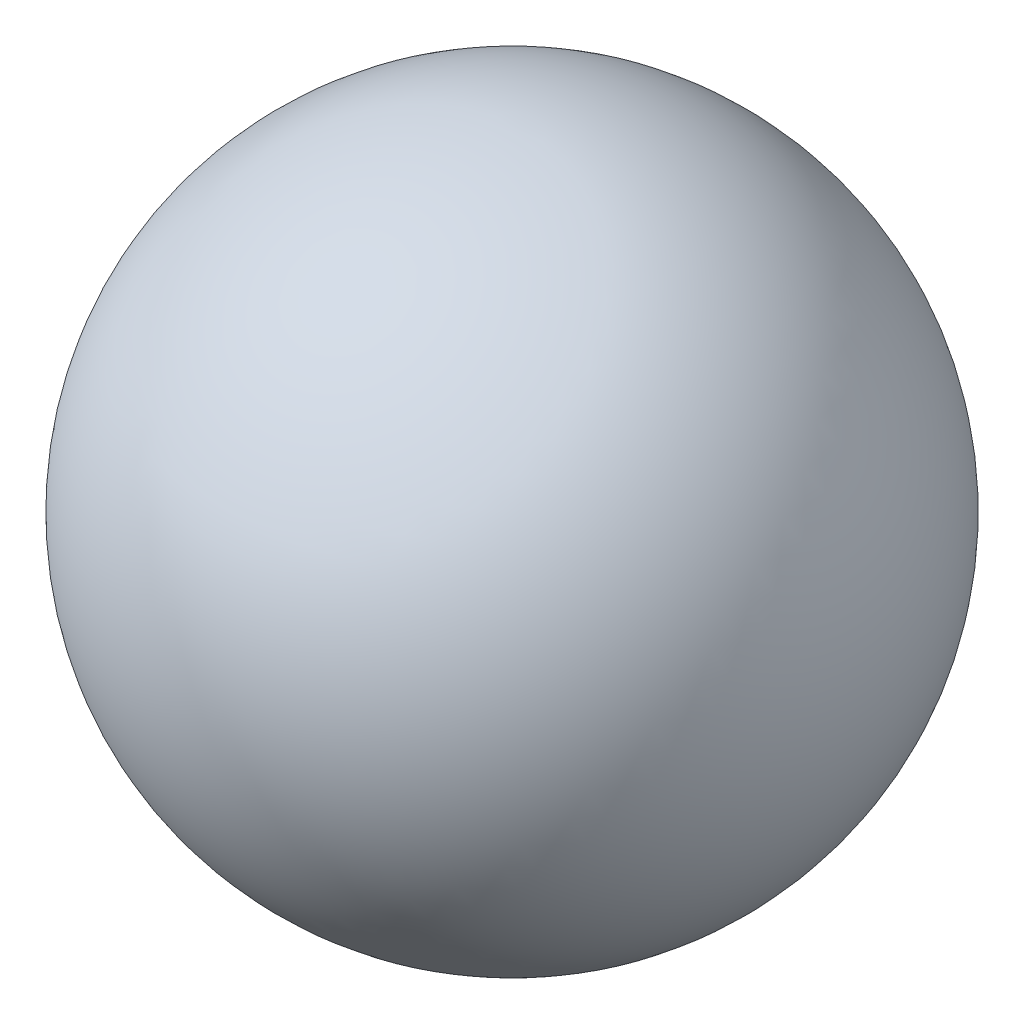
ISO-10303-21;
HEADER;
FILE_DESCRIPTION(('STEP AP214'),'2;1');
FILE_NAME('part.step','',(''),(''),'','','');
FILE_SCHEMA(('AUTOMOTIVE_DESIGN { 1 0 10303 214 1 1 1 1 }'));
ENDSEC;
DATA;
#1=APPLICATION_CONTEXT('core data for automotive mechanical design processes');
#2=APPLICATION_PROTOCOL_DEFINITION('international standard','automotive_design',2000,#1);
#3=PRODUCT_CONTEXT('',#1,'mechanical');
#4=PRODUCT('Part','Part','',(#3));
#5=PRODUCT_RELATED_PRODUCT_CATEGORY('part','',(#4));
#6=PRODUCT_DEFINITION_FORMATION('','',#4);
#7=PRODUCT_DEFINITION_CONTEXT('part definition',#1,'design');
#8=PRODUCT_DEFINITION('design','',#6,#7);
#9=PRODUCT_DEFINITION_SHAPE('','',#8);
#10=(LENGTH_UNIT() NAMED_UNIT(*) SI_UNIT(.MILLI.,.METRE.));
#11=(NAMED_UNIT(*) PLANE_ANGLE_UNIT() SI_UNIT($,.RADIAN.));
#12=(NAMED_UNIT(*) SI_UNIT($,.STERADIAN.) SOLID_ANGLE_UNIT());
#13=UNCERTAINTY_MEASURE_WITH_UNIT(LENGTH_MEASURE(1.E-05),#10,'distance_accuracy_value','');
#14=(GEOMETRIC_REPRESENTATION_CONTEXT(3) GLOBAL_UNCERTAINTY_ASSIGNED_CONTEXT((#13)) GLOBAL_UNIT_ASSIGNED_CONTEXT((#10,
#11,#12)) REPRESENTATION_CONTEXT('',''));
#15=CARTESIAN_POINT('',(0.,0.,0.));
#16=DIRECTION('',(0.,0.,1.));
#17=DIRECTION('',(1.,0.,0.));
#18=AXIS2_PLACEMENT_3D('',#15,#16,#17);
#19=CARTESIAN_POINT('',(0.,0.,0.));
#20=DIRECTION('',(0.,1.,0.));
#21=DIRECTION('',(1.,0.,0.));
#22=AXIS2_PLACEMENT_3D('',#19,#20,#21);
#23=SPHERICAL_SURFACE('',#22,1.75);
#24=CARTESIAN_POINT('',(0.,1.75,0.));
#25=VERTEX_POINT('',#24);
#26=VERTEX_LOOP('',#25);
#27=FACE_BOUND('',#26,.T.);
#28=ADVANCED_FACE('F29',(#27),#23,.T.);
#29=CLOSED_SHELL('',(#28));
#30=MANIFOLD_SOLID_BREP('B2',#29);
#31=ADVANCED_BREP_SHAPE_REPRESENTATION('',(#18,#30),#14);
#32=SHAPE_DEFINITION_REPRESENTATION(#9,#31);
ENDSEC;
END-ISO-10303-21;
